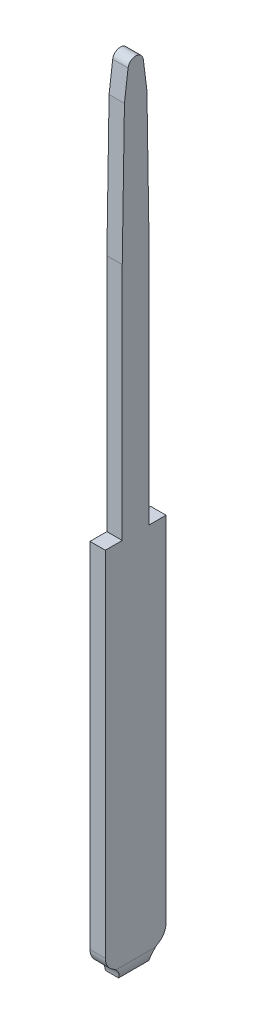
ISO-10303-21;
HEADER;
FILE_DESCRIPTION(('STEP AP214'),'2;1');
FILE_NAME('part.step','',(''),(''),'','','');
FILE_SCHEMA(('AUTOMOTIVE_DESIGN { 1 0 10303 214 1 1 1 1 }'));
ENDSEC;
DATA;
#1=APPLICATION_CONTEXT('core data for automotive mechanical design processes');
#2=APPLICATION_PROTOCOL_DEFINITION('international standard','automotive_design',2000,#1);
#3=PRODUCT_CONTEXT('',#1,'mechanical');
#4=PRODUCT('Part','Part','',(#3));
#5=PRODUCT_RELATED_PRODUCT_CATEGORY('part','',(#4));
#6=PRODUCT_DEFINITION_FORMATION('','',#4);
#7=PRODUCT_DEFINITION_CONTEXT('part definition',#1,'design');
#8=PRODUCT_DEFINITION('design','',#6,#7);
#9=PRODUCT_DEFINITION_SHAPE('','',#8);
#10=(LENGTH_UNIT() NAMED_UNIT(*) SI_UNIT(.MILLI.,.METRE.));
#11=(NAMED_UNIT(*) PLANE_ANGLE_UNIT() SI_UNIT($,.RADIAN.));
#12=(NAMED_UNIT(*) SI_UNIT($,.STERADIAN.) SOLID_ANGLE_UNIT());
#13=UNCERTAINTY_MEASURE_WITH_UNIT(LENGTH_MEASURE(1.E-05),#10,'distance_accuracy_value','');
#14=(GEOMETRIC_REPRESENTATION_CONTEXT(3) GLOBAL_UNCERTAINTY_ASSIGNED_CONTEXT((#13)) GLOBAL_UNIT_ASSIGNED_CONTEXT((#10,
#11,#12)) REPRESENTATION_CONTEXT('',''));
#15=CARTESIAN_POINT('',(0.,0.,0.));
#16=DIRECTION('',(0.,0.,1.));
#17=DIRECTION('',(1.,0.,0.));
#18=AXIS2_PLACEMENT_3D('',#15,#16,#17);
#19=CARTESIAN_POINT('',(-23.1025,2.72,30.8231450078228));
#20=DIRECTION('',(0.,0.,1.));
#21=DIRECTION('',(1.,0.,0.));
#22=AXIS2_PLACEMENT_3D('',#19,#20,#21);
#23=CYLINDRICAL_SURFACE('',#22,0.350000000000003);
#24=CARTESIAN_POINT('',(-22.7800000000001,2.58400827231018,30.8897284562516));
#25=CARTESIAN_POINT('',(-22.7759998870948,2.59345435826071,30.8892511748406));
#26=CARTESIAN_POINT('',(-22.7724533435217,2.60306396257316,30.8880628963178));
#27=CARTESIAN_POINT('',(-22.7662759401067,2.62226572410037,30.8842285541467));
#28=CARTESIAN_POINT('',(-22.7636434384853,2.63185788148878,30.8815851265223));
#29=CARTESIAN_POINT('',(-22.759282832296,2.6507399816502,30.8747948907125));
#30=CARTESIAN_POINT('',(-22.7575569732516,2.66002912110798,30.8706443924486));
#31=CARTESIAN_POINT('',(-22.7549179183652,2.67794649695542,30.8609191283657));
#32=CARTESIAN_POINT('',(-22.7540041177015,2.68657522083807,30.8553454265396));
#33=CARTESIAN_POINT('',(-22.7530854283882,2.69925844276396,30.8456917174861));
#34=CARTESIAN_POINT('',(-22.7528570249584,2.703639628215,30.8420509048076));
#35=CARTESIAN_POINT('',(-22.7525644575719,2.71207255440485,30.8344120667674));
#36=CARTESIAN_POINT('',(-22.752500042538,2.7161247895669,30.8304145971967));
#37=CARTESIAN_POINT('',(-22.7524999999999,2.71999999999733,30.8262500077298));
#38=B_SPLINE_CURVE_WITH_KNOTS('',3,(#24,#25,#26,#27,#28,#29,#30,#31,#32,#33,#34,#35,#36,#37),
.UNSPECIFIED.,.F.,.F.,(4,2,2,2,2,2,4),(0.,0.0307849792761848,0.0615143737613242,
0.0923195225418078,0.1231017083507,0.140184433440292,0.157240987974267),.UNSPECIFIED.);
#39=CARTESIAN_POINT('',(-22.7800000000001,2.58400827231022,30.8897284562516));
#40=VERTEX_POINT('',#39);
#41=CARTESIAN_POINT('',(-22.7525,2.7199999999983,30.8262500077282));
#42=VERTEX_POINT('',#41);
#43=EDGE_CURVE('E148',#40,#42,#38,.T.);
#44=ORIENTED_EDGE('',*,*,#43,.T.);
#45=DIRECTION('',(0.,0.,1.));
#46=VECTOR('',#45,1.);
#47=CARTESIAN_POINT('',(-22.7525,2.71999999999659,27.07467730181));
#48=LINE('',#47,#46);
#49=CARTESIAN_POINT('',(-22.7525,2.71999999999716,31.3437499922705));
#50=VERTEX_POINT('',#49);
#51=EDGE_CURVE('E20',#42,#50,#48,.T.);
#52=ORIENTED_EDGE('',*,*,#51,.T.);
#53=CARTESIAN_POINT('',(-22.7525,2.71999999999773,31.3437499922712));
#54=CARTESIAN_POINT('',(-22.752493827126,2.71295656353008,31.3361619664916));
#55=CARTESIAN_POINT('',(-22.7527120603056,2.70530048775807,31.3291332941318));
#56=CARTESIAN_POINT('',(-22.7537792924333,2.68903036869979,31.3163570944891));
#57=CARTESIAN_POINT('',(-22.7546280365287,2.68041671366318,31.3106090507956));
#58=CARTESIAN_POINT('',(-22.7571414164316,2.66246783891754,31.3005362454317));
#59=CARTESIAN_POINT('',(-22.7588083026607,2.65313068912981,31.2962154648209));
#60=CARTESIAN_POINT('',(-22.7630648067669,2.63410265079689,31.289104708849));
#61=CARTESIAN_POINT('',(-22.7656531247783,2.62441227774271,31.2863125910108));
#62=CARTESIAN_POINT('',(-22.7703324447124,2.60957319730867,31.2831928624191));
#63=CARTESIAN_POINT('',(-22.7720881093935,2.60442418532948,31.2823234952011));
#64=CARTESIAN_POINT('',(-22.7758544421237,2.59417260551571,31.2809949183669));
#65=CARTESIAN_POINT('',(-22.7778648432494,2.58906999497311,31.2805352834096));
#66=CARTESIAN_POINT('',(-22.7800000000001,2.58400827231021,31.2802715437483));
#67=B_SPLINE_CURVE_WITH_KNOTS('',3,(#53,#54,#55,#56,#57,#58,#59,#60,#61,#62,#63,#64,#65,#66),
.UNSPECIFIED.,.F.,.F.,(4,2,2,2,2,2,4),(0.,0.0310371499951021,0.062061761586695,
0.0931721933209761,0.124238910289562,0.140747421111541,0.157238774498873),.UNSPECIFIED.);
#68=CARTESIAN_POINT('',(-22.7800000000001,2.58400827231021,31.2802715437481));
#69=VERTEX_POINT('',#68);
#70=EDGE_CURVE('E165',#50,#69,#67,.T.);
#71=ORIENTED_EDGE('',*,*,#70,.T.);
#72=DIRECTION('',(0.,0.,-1.));
#73=VECTOR('',#72,1.);
#74=CARTESIAN_POINT('',(-22.7800000000001,2.58400827231021,31.2802715437477));
#75=LINE('',#74,#73);
#76=EDGE_CURVE('E153',#40,#69,#75,.F.);
#77=ORIENTED_EDGE('',*,*,#76,.F.);
#78=EDGE_LOOP('',(#44,#52,#71,#77));
#79=FACE_BOUND('',#78,.T.);
#80=ADVANCED_FACE('F16',(#79),#23,.T.);
#81=CARTESIAN_POINT('',(-22.7525,12.9719,27.07467730181));
#82=DIRECTION('',(-1.,0.,0.));
#83=DIRECTION('',(0.,0.,1.));
#84=AXIS2_PLACEMENT_3D('',#81,#82,#83);
#85=PLANE('',#84);
#86=DIRECTION('',(0.,0.,-1.));
#87=VECTOR('',#86,1.);
#88=CARTESIAN_POINT('',(-22.7525,7.51996953828895,30.69));
#89=LINE('',#88,#87);
#90=CARTESIAN_POINT('',(-22.7525,7.51996953828895,30.69));
#91=VERTEX_POINT('',#90);
#92=CARTESIAN_POINT('',(-22.7525,7.51996953828895,30.9100000000001));
#93=VERTEX_POINT('',#92);
#94=EDGE_CURVE('E339',#91,#93,#89,.F.);
#95=ORIENTED_EDGE('',*,*,#94,.T.);
#96=DIRECTION('',(0.,1.,0.));
#97=VECTOR('',#96,1.);
#98=CARTESIAN_POINT('',(-22.7525,9.0184,30.91));
#99=LINE('',#98,#97);
#100=CARTESIAN_POINT('',(-22.7525,10.6299999999999,30.910000000001));
#101=VERTEX_POINT('',#100);
#102=EDGE_CURVE('E333',#93,#101,#99,.T.);
#103=ORIENTED_EDGE('',*,*,#102,.T.);
#104=DIRECTION('',(0.,-0.999874047483614,-0.0158710166257951));
#105=VECTOR('',#104,1.);
#106=CARTESIAN_POINT('',(-22.7525,10.59392436524,30.90942737088));
#107=LINE('',#106,#105);
#108=CARTESIAN_POINT('',(-22.7525,12.4337817422844,30.9386314565568));
#109=VERTEX_POINT('',#108);
#110=EDGE_CURVE('E143',#101,#109,#107,.F.);
#111=ORIENTED_EDGE('',*,*,#110,.T.);
#112=DIRECTION('',(0.,-0.992134075863704,-0.125179772767304));
#113=VECTOR('',#112,1.);
#114=CARTESIAN_POINT('',(-22.7525,12.40865822602,30.93546156655));
#115=LINE('',#114,#113);
#116=CARTESIAN_POINT('',(-22.7525,12.8075179772988,30.9857865924167));
#117=VERTEX_POINT('',#116);
#118=EDGE_CURVE('E267',#109,#117,#115,.F.);
#119=ORIENTED_EDGE('',*,*,#118,.T.);
#120=CARTESIAN_POINT('',(-22.7525,12.795,31.085));
#121=DIRECTION('',(-1.,0.,0.));
#122=DIRECTION('',(0.,0.,1.));
#123=AXIS2_PLACEMENT_3D('',#120,#121,#122);
#124=CIRCLE('',#123,0.100000000000003);
#125=CARTESIAN_POINT('',(-22.7525,12.8075179772774,31.184213407586));
#126=VERTEX_POINT('',#125);
#127=EDGE_CURVE('E324',#126,#117,#124,.T.);
#128=ORIENTED_EDGE('',*,*,#127,.F.);
#129=DIRECTION('',(0.,0.992134075863704,-0.125179772767304));
#130=VECTOR('',#129,1.);
#131=CARTESIAN_POINT('',(-22.7525,12.83264148905,31.18104351798));
#132=LINE('',#131,#130);
#133=CARTESIAN_POINT('',(-22.7525,12.4337817422869,31.2313685436075));
#134=VERTEX_POINT('',#133);
#135=EDGE_CURVE('E318',#126,#134,#132,.F.);
#136=ORIENTED_EDGE('',*,*,#135,.T.);
#137=DIRECTION('',(0.,0.999874047483612,-0.0158710166258778));
#138=VECTOR('',#137,1.);
#139=CARTESIAN_POINT('',(-22.7525,12.46985737255,31.23079591472));
#140=LINE('',#139,#138);
#141=CARTESIAN_POINT('',(-22.7525,10.63,31.259999999999));
#142=VERTEX_POINT('',#141);
#143=EDGE_CURVE('E317',#134,#142,#140,.F.);
#144=ORIENTED_EDGE('',*,*,#143,.T.);
#145=DIRECTION('',(0.,1.,0.));
#146=VECTOR('',#145,1.);
#147=CARTESIAN_POINT('',(-22.7525,10.6616,31.26));
#148=LINE('',#147,#146);
#149=CARTESIAN_POINT('',(-22.7525,7.51996953828895,31.2599999999997));
#150=VERTEX_POINT('',#149);
#151=EDGE_CURVE('E311',#142,#150,#148,.F.);
#152=ORIENTED_EDGE('',*,*,#151,.T.);
#153=DIRECTION('',(0.,0.,-1.));
#154=VECTOR('',#153,1.);
#155=CARTESIAN_POINT('',(-22.7525,7.51996953828895,31.48));
#156=LINE('',#155,#154);
#157=CARTESIAN_POINT('',(-22.7525,7.51996953828895,31.48));
#158=VERTEX_POINT('',#157);
#159=EDGE_CURVE('E297',#150,#158,#156,.F.);
#160=ORIENTED_EDGE('',*,*,#159,.T.);
#161=DIRECTION('',(0.,1.,0.));
#162=VECTOR('',#161,1.);
#163=CARTESIAN_POINT('',(-22.7525,7.169637783627,31.48));
#164=LINE('',#163,#162);
#165=CARTESIAN_POINT('',(-22.7525,2.92,31.48));
#166=VERTEX_POINT('',#165);
#167=EDGE_CURVE('E293',#158,#166,#164,.F.);
#168=ORIENTED_EDGE('',*,*,#167,.T.);
#169=CARTESIAN_POINT('',(-22.7525,2.92,31.28));
#170=DIRECTION('',(-1.,0.,0.));
#171=DIRECTION('',(0.,0.,1.));
#172=AXIS2_PLACEMENT_3D('',#169,#170,#171);
#173=CIRCLE('',#172,0.199999999999999);
#174=CARTESIAN_POINT('',(-22.7525,2.746794919243,31.38));
#175=VERTEX_POINT('',#174);
#176=EDGE_CURVE('E290',#175,#166,#173,.T.);
#177=ORIENTED_EDGE('',*,*,#176,.F.);
#178=CARTESIAN_POINT('',(-22.7525,2.573589838486,31.48));
#179=DIRECTION('',(-1.,0.,0.));
#180=DIRECTION('',(0.,0.,1.));
#181=AXIS2_PLACEMENT_3D('',#178,#179,#180);
#182=CIRCLE('',#181,0.199999999999999);
#183=EDGE_CURVE('E138',#175,#50,#182,.T.);
#184=ORIENTED_EDGE('',*,*,#183,.T.);
#185=ORIENTED_EDGE('',*,*,#51,.F.);
#186=CARTESIAN_POINT('',(-22.7525,2.573589838486,30.69));
#187=DIRECTION('',(-1.,0.,0.));
#188=DIRECTION('',(0.,0.,1.));
#189=AXIS2_PLACEMENT_3D('',#186,#187,#188);
#190=CIRCLE('',#189,0.200000000000002);
#191=CARTESIAN_POINT('',(-22.7525,2.746794919243,30.79));
#192=VERTEX_POINT('',#191);
#193=EDGE_CURVE('E135',#42,#192,#190,.T.);
#194=ORIENTED_EDGE('',*,*,#193,.T.);
#195=CARTESIAN_POINT('',(-22.7525,2.92,30.89));
#196=DIRECTION('',(-1.,0.,0.));
#197=DIRECTION('',(0.,0.,1.));
#198=AXIS2_PLACEMENT_3D('',#195,#196,#197);
#199=CIRCLE('',#198,0.199999999999999);
#200=CARTESIAN_POINT('',(-22.7525,2.92,30.6899999999999));
#201=VERTEX_POINT('',#200);
#202=EDGE_CURVE('E280',#201,#192,#199,.T.);
#203=ORIENTED_EDGE('',*,*,#202,.F.);
#204=DIRECTION('',(0.,1.,0.));
#205=VECTOR('',#204,1.);
#206=CARTESIAN_POINT('',(-22.7525,2.92,30.6899999999999));
#207=LINE('',#206,#205);
#208=EDGE_CURVE('E253',#91,#201,#207,.F.);
#209=ORIENTED_EDGE('',*,*,#208,.F.);
#210=EDGE_LOOP('',(#95,#103,#111,#119,#128,#136,#144,#152,#160,#168,#177,#184,#185,#194,#203,#209));
#211=FACE_BOUND('',#210,.T.);
#212=ADVANCED_FACE('F133',(#211),#85,.F.);
#213=CARTESIAN_POINT('',(-22.72717730181,10.59392436524,30.90942737088));
#214=DIRECTION('',(0.,-0.0158710166257951,0.999874047483614));
#215=DIRECTION('',(0.,-0.999874047483614,-0.0158710166257951));
#216=AXIS2_PLACEMENT_3D('',#213,#214,#215);
#217=PLANE('',#216);
#218=ORIENTED_EDGE('',*,*,#110,.F.);
#219=DIRECTION('',(1.,0.,0.));
#220=VECTOR('',#219,1.);
#221=CARTESIAN_POINT('',(-22.72717730181,10.6299999999999,30.91));
#222=LINE('',#221,#220);
#223=CARTESIAN_POINT('',(-22.9525,10.629999999977,30.9100000000005));
#224=VERTEX_POINT('',#223);
#225=EDGE_CURVE('E331',#101,#224,#222,.F.);
#226=ORIENTED_EDGE('',*,*,#225,.T.);
#227=DIRECTION('',(0.,0.999874047482143,0.0158710167184618));
#228=VECTOR('',#227,1.);
#229=CARTESIAN_POINT('',(-22.9525,10.6299999999999,30.9100000000016));
#230=LINE('',#229,#228);
#231=CARTESIAN_POINT('',(-22.9525,12.4337817422973,30.9386314565031));
#232=VERTEX_POINT('',#231);
#233=EDGE_CURVE('E328',#224,#232,#230,.T.);
#234=ORIENTED_EDGE('',*,*,#233,.T.);
#235=DIRECTION('',(1.,0.,0.));
#236=VECTOR('',#235,1.);
#237=CARTESIAN_POINT('',(-22.72717730181,12.4337817422699,30.9386314567209));
#238=LINE('',#237,#236);
#239=EDGE_CURVE('E325',#232,#109,#238,.T.);
#240=ORIENTED_EDGE('',*,*,#239,.T.);
#241=EDGE_LOOP('',(#218,#226,#234,#240));
#242=FACE_BOUND('',#241,.T.);
#243=ADVANCED_FACE('F217',(#242),#217,.F.);
#244=CARTESIAN_POINT('',(-22.72717730181,12.40865822602,30.93546156655));
#245=DIRECTION('',(0.,-0.125179772767304,0.992134075863704));
#246=DIRECTION('',(0.,-0.992134075863704,-0.125179772767304));
#247=AXIS2_PLACEMENT_3D('',#244,#245,#246);
#248=PLANE('',#247);
#249=ORIENTED_EDGE('',*,*,#118,.F.);
#250=ORIENTED_EDGE('',*,*,#239,.F.);
#251=DIRECTION('',(0.,0.992134075754432,0.125179773633356));
#252=VECTOR('',#251,1.);
#253=CARTESIAN_POINT('',(-22.9525,12.4337817423111,30.9386314563943));
#254=LINE('',#253,#252);
#255=CARTESIAN_POINT('',(-22.9525,12.8075179773421,30.9857865924218));
#256=VERTEX_POINT('',#255);
#257=EDGE_CURVE('E279',#232,#256,#254,.T.);
#258=ORIENTED_EDGE('',*,*,#257,.T.);
#259=DIRECTION('',(-1.,0.,0.));
#260=VECTOR('',#259,1.);
#261=CARTESIAN_POINT('',(-22.7525,12.8075179773209,30.9857865924192));
#262=LINE('',#261,#260);
#263=EDGE_CURVE('E322',#117,#256,#262,.T.);
#264=ORIENTED_EDGE('',*,*,#263,.F.);
#265=EDGE_LOOP('',(#249,#250,#258,#264));
#266=FACE_BOUND('',#265,.T.);
#267=ADVANCED_FACE('F213',(#266),#248,.F.);
#268=CARTESIAN_POINT('',(-22.7525,12.795,31.085));
#269=DIRECTION('',(-1.,0.,0.));
#270=DIRECTION('',(0.,0.,1.));
#271=AXIS2_PLACEMENT_3D('',#268,#269,#270);
#272=CYLINDRICAL_SURFACE('',#271,0.100000000000003);
#273=CARTESIAN_POINT('',(-22.9525,12.795,31.085));
#274=DIRECTION('',(-1.,0.,0.));
#275=DIRECTION('',(0.,0.,1.));
#276=AXIS2_PLACEMENT_3D('',#273,#274,#275);
#277=CIRCLE('',#276,0.100000000000003);
#278=CARTESIAN_POINT('',(-22.9525,12.8075179772991,31.1842134075835));
#279=VERTEX_POINT('',#278);
#280=EDGE_CURVE('E277',#256,#279,#277,.F.);
#281=ORIENTED_EDGE('',*,*,#280,.T.);
#282=DIRECTION('',(1.,0.,0.));
#283=VECTOR('',#282,1.);
#284=CARTESIAN_POINT('',(-22.72717730181,12.8075179772781,31.1842134075859));
#285=LINE('',#284,#283);
#286=EDGE_CURVE('E319',#279,#126,#285,.T.);
#287=ORIENTED_EDGE('',*,*,#286,.T.);
#288=ORIENTED_EDGE('',*,*,#127,.T.);
#289=ORIENTED_EDGE('',*,*,#263,.T.);
#290=EDGE_LOOP('',(#281,#287,#288,#289));
#291=FACE_BOUND('',#290,.T.);
#292=ADVANCED_FACE('F209',(#291),#272,.T.);
#293=CARTESIAN_POINT('',(-22.72717730181,12.83264148905,31.18104351798));
#294=DIRECTION('',(0.,-0.125179772767304,-0.992134075863704));
#295=DIRECTION('',(0.,0.992134075863704,-0.125179772767304));
#296=AXIS2_PLACEMENT_3D('',#293,#294,#295);
#297=PLANE('',#296);
#298=ORIENTED_EDGE('',*,*,#135,.F.);
#299=ORIENTED_EDGE('',*,*,#286,.F.);
#300=DIRECTION('',(0.,-0.992134075808946,0.125179773201296));
#301=VECTOR('',#300,1.);
#302=CARTESIAN_POINT('',(-22.9525,12.8075179772782,31.1842134075864));
#303=LINE('',#302,#301);
#304=CARTESIAN_POINT('',(-22.9525,12.433781742292,31.2313685435526));
#305=VERTEX_POINT('',#304);
#306=EDGE_CURVE('E278',#279,#305,#303,.T.);
#307=ORIENTED_EDGE('',*,*,#306,.T.);
#308=DIRECTION('',(1.,0.,0.));
#309=VECTOR('',#308,1.);
#310=CARTESIAN_POINT('',(-22.72717730181,12.4337817422955,31.2313685437716));
#311=LINE('',#310,#309);
#312=EDGE_CURVE('E314',#305,#134,#311,.T.);
#313=ORIENTED_EDGE('',*,*,#312,.T.);
#314=EDGE_LOOP('',(#298,#299,#307,#313));
#315=FACE_BOUND('',#314,.T.);
#316=ADVANCED_FACE('F205',(#315),#297,.F.);
#317=CARTESIAN_POINT('',(-22.72717730181,12.46985737255,31.23079591472));
#318=DIRECTION('',(0.,-0.0158710166258778,-0.999874047483613));
#319=DIRECTION('',(0.,0.999874047483612,-0.0158710166258778));
#320=AXIS2_PLACEMENT_3D('',#317,#318,#319);
#321=PLANE('',#320);
#322=ORIENTED_EDGE('',*,*,#143,.F.);
#323=ORIENTED_EDGE('',*,*,#312,.F.);
#324=DIRECTION('',(0.,-0.999874047480713,0.0158710168085275));
#325=VECTOR('',#324,1.);
#326=CARTESIAN_POINT('',(-22.9525,12.4337817422903,31.2313685434431));
#327=LINE('',#326,#325);
#328=CARTESIAN_POINT('',(-22.9525,10.6299999999997,31.2599999999987));
#329=VERTEX_POINT('',#328);
#330=EDGE_CURVE('E308',#305,#329,#327,.T.);
#331=ORIENTED_EDGE('',*,*,#330,.T.);
#332=DIRECTION('',(-1.,0.,0.));
#333=VECTOR('',#332,1.);
#334=CARTESIAN_POINT('',(-22.72717730181,10.63,31.26));
#335=LINE('',#334,#333);
#336=EDGE_CURVE('E305',#329,#142,#335,.F.);
#337=ORIENTED_EDGE('',*,*,#336,.T.);
#338=EDGE_LOOP('',(#322,#323,#331,#337));
#339=FACE_BOUND('',#338,.T.);
#340=ADVANCED_FACE('F201',(#339),#321,.F.);
#341=CARTESIAN_POINT('',(-22.72717730181,10.6616,31.26));
#342=DIRECTION('',(0.,0.,-1.));
#343=DIRECTION('',(-1.,0.,0.));
#344=AXIS2_PLACEMENT_3D('',#341,#342,#343);
#345=PLANE('',#344);
#346=DIRECTION('',(0.,1.,0.));
#347=VECTOR('',#346,1.);
#348=CARTESIAN_POINT('',(-22.9525,7.09982974541279,31.259999999998));
#349=LINE('',#348,#347);
#350=CARTESIAN_POINT('',(-22.9525,7.51996953828895,31.2599999999985));
#351=VERTEX_POINT('',#350);
#352=EDGE_CURVE('E301',#329,#351,#349,.F.);
#353=ORIENTED_EDGE('',*,*,#352,.T.);
#354=DIRECTION('',(1.,0.,0.));
#355=VECTOR('',#354,1.);
#356=CARTESIAN_POINT('',(-23.0025,7.51996953828895,31.2599999999995));
#357=LINE('',#356,#355);
#358=EDGE_CURVE('E302',#351,#150,#357,.T.);
#359=ORIENTED_EDGE('',*,*,#358,.T.);
#360=ORIENTED_EDGE('',*,*,#151,.F.);
#361=ORIENTED_EDGE('',*,*,#336,.F.);
#362=EDGE_LOOP('',(#353,#359,#360,#361));
#363=FACE_BOUND('',#362,.T.);
#364=ADVANCED_FACE('F197',(#363),#345,.F.);
#365=CARTESIAN_POINT('',(-23.0025,7.51996953828895,31.48));
#366=DIRECTION('',(0.,-1.,0.));
#367=DIRECTION('',(0.,0.,-1.));
#368=AXIS2_PLACEMENT_3D('',#365,#366,#367);
#369=PLANE('',#368);
#370=ORIENTED_EDGE('',*,*,#159,.F.);
#371=ORIENTED_EDGE('',*,*,#358,.F.);
#372=DIRECTION('',(0.,0.,-1.));
#373=VECTOR('',#372,1.);
#374=CARTESIAN_POINT('',(-22.9525,7.51996953828895,22.4322721492903));
#375=LINE('',#374,#373);
#376=CARTESIAN_POINT('',(-22.9525,7.51996953828895,31.48));
#377=VERTEX_POINT('',#376);
#378=EDGE_CURVE('E298',#351,#377,#375,.F.);
#379=ORIENTED_EDGE('',*,*,#378,.T.);
#380=DIRECTION('',(-1.,0.,0.));
#381=VECTOR('',#380,1.);
#382=CARTESIAN_POINT('',(-22.75195,7.51996953828895,31.48));
#383=LINE('',#382,#381);
#384=EDGE_CURVE('E294',#377,#158,#383,.F.);
#385=ORIENTED_EDGE('',*,*,#384,.T.);
#386=EDGE_LOOP('',(#370,#371,#379,#385));
#387=FACE_BOUND('',#386,.T.);
#388=ADVANCED_FACE('F193',(#387),#369,.F.);
#389=CARTESIAN_POINT('',(-22.75195,7.169637783627,31.48));
#390=DIRECTION('',(0.,0.,-1.));
#391=DIRECTION('',(-1.,0.,0.));
#392=AXIS2_PLACEMENT_3D('',#389,#390,#391);
#393=PLANE('',#392);
#394=ORIENTED_EDGE('',*,*,#384,.F.);
#395=DIRECTION('',(0.,1.,0.));
#396=VECTOR('',#395,1.);
#397=CARTESIAN_POINT('',(-22.9525,7.09982974541279,31.48));
#398=LINE('',#397,#396);
#399=CARTESIAN_POINT('',(-22.9525,2.92,31.48));
#400=VERTEX_POINT('',#399);
#401=EDGE_CURVE('E276',#377,#400,#398,.F.);
#402=ORIENTED_EDGE('',*,*,#401,.T.);
#403=DIRECTION('',(-1.,0.,0.));
#404=VECTOR('',#403,1.);
#405=CARTESIAN_POINT('',(-22.7525,2.92,31.48));
#406=LINE('',#405,#404);
#407=EDGE_CURVE('E291',#166,#400,#406,.T.);
#408=ORIENTED_EDGE('',*,*,#407,.F.);
#409=ORIENTED_EDGE('',*,*,#167,.F.);
#410=EDGE_LOOP('',(#394,#402,#408,#409));
#411=FACE_BOUND('',#410,.T.);
#412=ADVANCED_FACE('F189',(#411),#393,.F.);
#413=CARTESIAN_POINT('',(-22.7525,2.92,31.28));
#414=DIRECTION('',(-1.,0.,0.));
#415=DIRECTION('',(0.,0.,1.));
#416=AXIS2_PLACEMENT_3D('',#413,#414,#415);
#417=CYLINDRICAL_SURFACE('',#416,0.199999999999999);
#418=DIRECTION('',(-1.,0.,0.));
#419=VECTOR('',#418,1.);
#420=CARTESIAN_POINT('',(-22.7525,2.74679491924291,31.38));
#421=LINE('',#420,#419);
#422=CARTESIAN_POINT('',(-22.9525,2.74679491924291,31.38));
#423=VERTEX_POINT('',#422);
#424=EDGE_CURVE('E287',#423,#175,#421,.F.);
#425=ORIENTED_EDGE('',*,*,#424,.T.);
#426=ORIENTED_EDGE('',*,*,#176,.T.);
#427=ORIENTED_EDGE('',*,*,#407,.T.);
#428=CARTESIAN_POINT('',(-22.9525,2.92,31.28));
#429=DIRECTION('',(-1.,0.,0.));
#430=DIRECTION('',(0.,0.,1.));
#431=AXIS2_PLACEMENT_3D('',#428,#429,#430);
#432=CIRCLE('',#431,0.199999999999999);
#433=EDGE_CURVE('E273',#400,#423,#432,.F.);
#434=ORIENTED_EDGE('',*,*,#433,.T.);
#435=EDGE_LOOP('',(#425,#426,#427,#434));
#436=FACE_BOUND('',#435,.T.);
#437=ADVANCED_FACE('F185',(#436),#417,.T.);
#438=CARTESIAN_POINT('',(-22.7525,2.573589838486,31.48));
#439=DIRECTION('',(-1.,0.,0.));
#440=DIRECTION('',(0.,0.,1.));
#441=AXIS2_PLACEMENT_3D('',#438,#439,#440);
#442=CYLINDRICAL_SURFACE('',#441,0.199999999999999);
#443=ORIENTED_EDGE('',*,*,#183,.F.);
#444=ORIENTED_EDGE('',*,*,#424,.F.);
#445=CARTESIAN_POINT('',(-22.9525,2.573589838486,31.48));
#446=DIRECTION('',(-1.,0.,0.));
#447=DIRECTION('',(0.,0.,1.));
#448=AXIS2_PLACEMENT_3D('',#445,#446,#447);
#449=CIRCLE('',#448,0.199999999999999);
#450=CARTESIAN_POINT('',(-22.9525,2.58400827231021,31.2802715437481));
#451=VERTEX_POINT('',#450);
#452=EDGE_CURVE('E270',#423,#451,#449,.T.);
#453=ORIENTED_EDGE('',*,*,#452,.T.);
#454=DIRECTION('',(1.,0.,0.));
#455=VECTOR('',#454,1.);
#456=CARTESIAN_POINT('',(-22.9549485571551,2.58400827231021,31.2802715437479));
#457=LINE('',#456,#455);
#458=EDGE_CURVE('E156',#69,#451,#457,.F.);
#459=ORIENTED_EDGE('',*,*,#458,.F.);
#460=ORIENTED_EDGE('',*,*,#70,.F.);
#461=EDGE_LOOP('',(#443,#444,#453,#459,#460));
#462=FACE_BOUND('',#461,.T.);
#463=ADVANCED_FACE('F180',(#462),#442,.F.);
#464=CARTESIAN_POINT('',(-22.9549485571551,2.58400827231021,31.2802715437477));
#465=DIRECTION('',(0.,-1.,0.));
#466=DIRECTION('',(0.,0.,-1.));
#467=AXIS2_PLACEMENT_3D('',#464,#465,#466);
#468=PLANE('',#467);
#469=ORIENTED_EDGE('',*,*,#76,.T.);
#470=ORIENTED_EDGE('',*,*,#458,.T.);
#471=DIRECTION('',(0.,0.,-1.));
#472=VECTOR('',#471,1.);
#473=CARTESIAN_POINT('',(-22.9525,2.58400827231021,22.4322721492903));
#474=LINE('',#473,#472);
#475=CARTESIAN_POINT('',(-22.9525,2.58400827231019,30.8897284562516));
#476=VERTEX_POINT('',#475);
#477=EDGE_CURVE('E264',#451,#476,#474,.T.);
#478=ORIENTED_EDGE('',*,*,#477,.T.);
#479=DIRECTION('',(-1.,0.,0.));
#480=VECTOR('',#479,1.);
#481=CARTESIAN_POINT('',(-22.7525,2.58400827231017,30.8897284562516));
#482=LINE('',#481,#480);
#483=EDGE_CURVE('E154',#476,#40,#482,.F.);
#484=ORIENTED_EDGE('',*,*,#483,.T.);
#485=EDGE_LOOP('',(#469,#470,#478,#484));
#486=FACE_BOUND('',#485,.T.);
#487=ADVANCED_FACE('F177',(#486),#468,.T.);
#488=CARTESIAN_POINT('',(-22.7525,2.573589838486,30.69));
#489=DIRECTION('',(-1.,0.,0.));
#490=DIRECTION('',(0.,0.,1.));
#491=AXIS2_PLACEMENT_3D('',#488,#489,#490);
#492=CYLINDRICAL_SURFACE('',#491,0.200000000000002);
#493=ORIENTED_EDGE('',*,*,#193,.F.);
#494=ORIENTED_EDGE('',*,*,#43,.F.);
#495=ORIENTED_EDGE('',*,*,#483,.F.);
#496=CARTESIAN_POINT('',(-22.9525,2.573589838486,30.69));
#497=DIRECTION('',(-1.,0.,0.));
#498=DIRECTION('',(0.,0.,1.));
#499=AXIS2_PLACEMENT_3D('',#496,#497,#498);
#500=CIRCLE('',#499,0.200000000000002);
#501=CARTESIAN_POINT('',(-22.9525,2.74679491924308,30.7900000000001));
#502=VERTEX_POINT('',#501);
#503=EDGE_CURVE('E262',#476,#502,#500,.T.);
#504=ORIENTED_EDGE('',*,*,#503,.T.);
#505=DIRECTION('',(-1.,0.,0.));
#506=VECTOR('',#505,1.);
#507=CARTESIAN_POINT('',(-22.7525,2.74679491924308,30.7900000000001));
#508=LINE('',#507,#506);
#509=EDGE_CURVE('E151',#192,#502,#508,.T.);
#510=ORIENTED_EDGE('',*,*,#509,.F.);
#511=EDGE_LOOP('',(#493,#494,#495,#504,#510));
#512=FACE_BOUND('',#511,.T.);
#513=ADVANCED_FACE('F147',(#512),#492,.F.);
#514=CARTESIAN_POINT('',(-22.7525,2.92,30.89));
#515=DIRECTION('',(-1.,0.,0.));
#516=DIRECTION('',(0.,0.,1.));
#517=AXIS2_PLACEMENT_3D('',#514,#515,#516);
#518=CYLINDRICAL_SURFACE('',#517,0.199999999999999);
#519=DIRECTION('',(1.,0.,0.));
#520=VECTOR('',#519,1.);
#521=CARTESIAN_POINT('',(-22.9549485571551,2.92,30.6899999999999));
#522=LINE('',#521,#520);
#523=CARTESIAN_POINT('',(-22.9525,2.92,30.69));
#524=VERTEX_POINT('',#523);
#525=EDGE_CURVE('E249',#201,#524,#522,.F.);
#526=ORIENTED_EDGE('',*,*,#525,.F.);
#527=ORIENTED_EDGE('',*,*,#202,.T.);
#528=ORIENTED_EDGE('',*,*,#509,.T.);
#529=CARTESIAN_POINT('',(-22.9525,2.92,30.89));
#530=DIRECTION('',(-1.,0.,0.));
#531=DIRECTION('',(0.,0.,1.));
#532=AXIS2_PLACEMENT_3D('',#529,#530,#531);
#533=CIRCLE('',#532,0.199999999999999);
#534=EDGE_CURVE('E259',#502,#524,#533,.F.);
#535=ORIENTED_EDGE('',*,*,#534,.T.);
#536=EDGE_LOOP('',(#526,#527,#528,#535));
#537=FACE_BOUND('',#536,.T.);
#538=ADVANCED_FACE('F176',(#537),#518,.T.);
#539=CARTESIAN_POINT('',(-22.9549485571551,2.92,30.6899999999999));
#540=DIRECTION('',(0.,0.,-1.));
#541=DIRECTION('',(0.,1.,0.));
#542=AXIS2_PLACEMENT_3D('',#539,#540,#541);
#543=PLANE('',#542);
#544=ORIENTED_EDGE('',*,*,#525,.T.);
#545=DIRECTION('',(0.,1.,0.));
#546=VECTOR('',#545,1.);
#547=CARTESIAN_POINT('',(-22.9525,7.09982974541279,30.6900000000001));
#548=LINE('',#547,#546);
#549=CARTESIAN_POINT('',(-22.9525,7.51996953828895,30.6900000000001));
#550=VERTEX_POINT('',#549);
#551=EDGE_CURVE('E252',#524,#550,#548,.T.);
#552=ORIENTED_EDGE('',*,*,#551,.T.);
#553=DIRECTION('',(1.,0.,0.));
#554=VECTOR('',#553,1.);
#555=CARTESIAN_POINT('',(-23.0025,7.51996953828895,30.69));
#556=LINE('',#555,#554);
#557=EDGE_CURVE('E255',#550,#91,#556,.T.);
#558=ORIENTED_EDGE('',*,*,#557,.T.);
#559=ORIENTED_EDGE('',*,*,#208,.T.);
#560=EDGE_LOOP('',(#544,#552,#558,#559));
#561=FACE_BOUND('',#560,.T.);
#562=ADVANCED_FACE('F239',(#561),#543,.T.);
#563=CARTESIAN_POINT('',(-23.0025,7.51996953828895,30.69));
#564=DIRECTION('',(0.,-1.,0.));
#565=DIRECTION('',(0.,0.,-1.));
#566=AXIS2_PLACEMENT_3D('',#563,#564,#565);
#567=PLANE('',#566);
#568=ORIENTED_EDGE('',*,*,#94,.F.);
#569=ORIENTED_EDGE('',*,*,#557,.F.);
#570=DIRECTION('',(0.,0.,-1.));
#571=VECTOR('',#570,1.);
#572=CARTESIAN_POINT('',(-22.9525,7.51996953828895,22.4322721492903));
#573=LINE('',#572,#571);
#574=CARTESIAN_POINT('',(-22.9525,7.51996953828895,30.9100000000003));
#575=VERTEX_POINT('',#574);
#576=EDGE_CURVE('E26',#550,#575,#573,.F.);
#577=ORIENTED_EDGE('',*,*,#576,.T.);
#578=DIRECTION('',(1.,0.,0.));
#579=VECTOR('',#578,1.);
#580=CARTESIAN_POINT('',(-22.72717730181,7.51996953828895,30.91));
#581=LINE('',#580,#579);
#582=EDGE_CURVE('E34',#575,#93,#581,.T.);
#583=ORIENTED_EDGE('',*,*,#582,.T.);
#584=EDGE_LOOP('',(#568,#569,#577,#583));
#585=FACE_BOUND('',#584,.T.);
#586=ADVANCED_FACE('F234',(#585),#567,.F.);
#587=CARTESIAN_POINT('',(-22.72717730181,9.0184,30.91));
#588=DIRECTION('',(0.,0.,1.));
#589=DIRECTION('',(1.,0.,0.));
#590=AXIS2_PLACEMENT_3D('',#587,#588,#589);
#591=PLANE('',#590);
#592=ORIENTED_EDGE('',*,*,#225,.F.);
#593=ORIENTED_EDGE('',*,*,#102,.F.);
#594=ORIENTED_EDGE('',*,*,#582,.F.);
#595=DIRECTION('',(0.,1.,0.));
#596=VECTOR('',#595,1.);
#597=CARTESIAN_POINT('',(-22.9525,7.09982974541279,30.9100000000005));
#598=LINE('',#597,#596);
#599=EDGE_CURVE('E11',#575,#224,#598,.T.);
#600=ORIENTED_EDGE('',*,*,#599,.T.);
#601=EDGE_LOOP('',(#592,#593,#594,#600));
#602=FACE_BOUND('',#601,.T.);
#603=ADVANCED_FACE('F228',(#602),#591,.F.);
#604=CARTESIAN_POINT('',(-22.9525,7.09982974541279,22.4322721492903));
#605=DIRECTION('',(1.,0.,0.));
#606=DIRECTION('',(0.,0.,-1.));
#607=AXIS2_PLACEMENT_3D('',#604,#605,#606);
#608=PLANE('',#607);
#609=ORIENTED_EDGE('',*,*,#576,.F.);
#610=ORIENTED_EDGE('',*,*,#551,.F.);
#611=ORIENTED_EDGE('',*,*,#534,.F.);
#612=ORIENTED_EDGE('',*,*,#503,.F.);
#613=ORIENTED_EDGE('',*,*,#477,.F.);
#614=ORIENTED_EDGE('',*,*,#452,.F.);
#615=ORIENTED_EDGE('',*,*,#433,.F.);
#616=ORIENTED_EDGE('',*,*,#401,.F.);
#617=ORIENTED_EDGE('',*,*,#378,.F.);
#618=ORIENTED_EDGE('',*,*,#352,.F.);
#619=ORIENTED_EDGE('',*,*,#330,.F.);
#620=ORIENTED_EDGE('',*,*,#306,.F.);
#621=ORIENTED_EDGE('',*,*,#280,.F.);
#622=ORIENTED_EDGE('',*,*,#257,.F.);
#623=ORIENTED_EDGE('',*,*,#233,.F.);
#624=ORIENTED_EDGE('',*,*,#599,.F.);
#625=EDGE_LOOP('',(#609,#610,#611,#612,#613,#614,#615,#616,#617,#618,#619,#620,#621,#622,#623,#624));
#626=FACE_BOUND('',#625,.T.);
#627=ADVANCED_FACE('F226',(#626),#608,.F.);
#628=CLOSED_SHELL('',(#80,#212,#243,#267,#292,#316,#340,#364,#388,#412,#437,#463,#487,#513,#538,
#562,#586,#603,#627));
#629=MANIFOLD_SOLID_BREP('B1',#628);
#630=ADVANCED_BREP_SHAPE_REPRESENTATION('',(#18,#629),#14);
#631=SHAPE_DEFINITION_REPRESENTATION(#9,#630);
ENDSEC;
END-ISO-10303-21;
